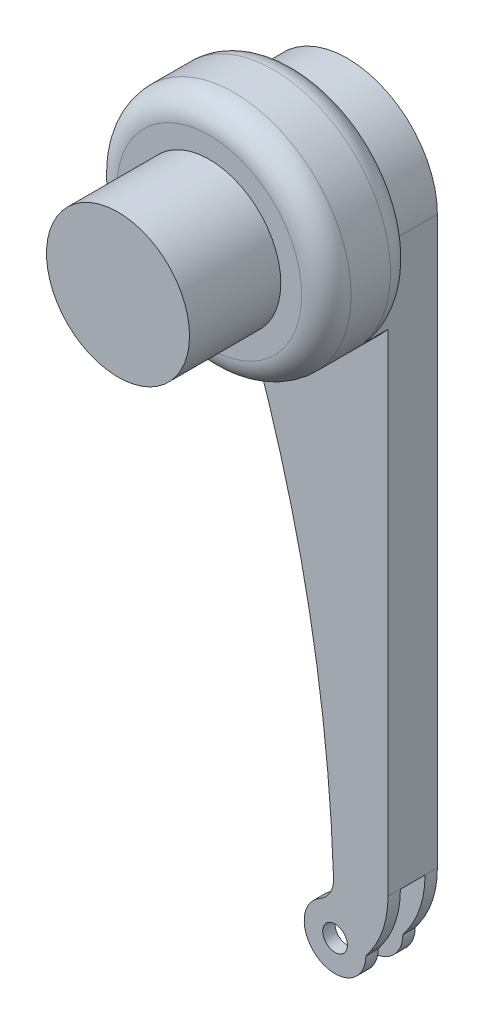
ISO-10303-21;
HEADER;
FILE_DESCRIPTION(('STEP AP214'),'2;1');
FILE_NAME('part.step','',(''),(''),'','','');
FILE_SCHEMA(('AUTOMOTIVE_DESIGN { 1 0 10303 214 1 1 1 1 }'));
ENDSEC;
DATA;
#1=APPLICATION_CONTEXT('core data for automotive mechanical design processes');
#2=APPLICATION_PROTOCOL_DEFINITION('international standard','automotive_design',2000,#1);
#3=PRODUCT_CONTEXT('',#1,'mechanical');
#4=PRODUCT('Part','Part','',(#3));
#5=PRODUCT_RELATED_PRODUCT_CATEGORY('part','',(#4));
#6=PRODUCT_DEFINITION_FORMATION('','',#4);
#7=PRODUCT_DEFINITION_CONTEXT('part definition',#1,'design');
#8=PRODUCT_DEFINITION('design','',#6,#7);
#9=PRODUCT_DEFINITION_SHAPE('','',#8);
#10=(LENGTH_UNIT() NAMED_UNIT(*) SI_UNIT(.MILLI.,.METRE.));
#11=(NAMED_UNIT(*) PLANE_ANGLE_UNIT() SI_UNIT($,.RADIAN.));
#12=(NAMED_UNIT(*) SI_UNIT($,.STERADIAN.) SOLID_ANGLE_UNIT());
#13=UNCERTAINTY_MEASURE_WITH_UNIT(LENGTH_MEASURE(1.E-05),#10,'distance_accuracy_value','');
#14=(GEOMETRIC_REPRESENTATION_CONTEXT(3) GLOBAL_UNCERTAINTY_ASSIGNED_CONTEXT((#13)) GLOBAL_UNIT_ASSIGNED_CONTEXT((#10,
#11,#12)) REPRESENTATION_CONTEXT('',''));
#15=CARTESIAN_POINT('',(0.,0.,0.));
#16=DIRECTION('',(0.,0.,1.));
#17=DIRECTION('',(1.,0.,0.));
#18=AXIS2_PLACEMENT_3D('',#15,#16,#17);
#19=CARTESIAN_POINT('',(14.3935138395394,-234.123931836955,-20.));
#20=CARTESIAN_POINT('',(9.34180295752292,-94.6674336041747,-20.));
#21=CARTESIAN_POINT('',(-37.9577807284117,-27.6638546174901,-20.));
#22=CARTESIAN_POINT('',(-36.4999928582539,-0.0228330333449487,-20.));
#23=B_SPLINE_CURVE_WITH_KNOTS('',3,(#19,#20,#21,#22),.UNSPECIFIED.,.F.,.F.,(4,4),(0.,
0.87838720733707),.UNSPECIFIED.);
#24=DIRECTION('',(0.,0.,1.));
#25=VECTOR('',#24,1.);
#26=SURFACE_OF_LINEAR_EXTRUSION('',#23,#25);
#27=CARTESIAN_POINT('',(14.3935138395394,-234.123931836955,-5.));
#28=CARTESIAN_POINT('',(9.34180295752292,-94.6674336041747,-5.));
#29=CARTESIAN_POINT('',(-37.9577807284117,-27.6638546174901,-5.));
#30=CARTESIAN_POINT('',(-36.4999928582539,-0.0228330333449487,-5.));
#31=B_SPLINE_CURVE_WITH_KNOTS('',3,(#27,#28,#29,#30),.UNSPECIFIED.,.F.,.F.,(4,4),(0.,
0.87838720733707),.UNSPECIFIED.);
#32=CARTESIAN_POINT('',(14.3935138395395,-234.123931836956,-5.));
#33=VERTEX_POINT('',#32);
#34=CARTESIAN_POINT('',(14.211921684478,-229.555725830061,-5.));
#35=VERTEX_POINT('',#34);
#36=EDGE_CURVE('E406',#33,#35,#31,.T.);
#37=ORIENTED_EDGE('',*,*,#36,.F.);
#38=DIRECTION('',(0.,0.,1.));
#39=VECTOR('',#38,1.);
#40=CARTESIAN_POINT('',(14.3935138395395,-234.123931836956,-20.));
#41=LINE('',#40,#39);
#42=CARTESIAN_POINT('',(14.3935138395395,-234.123931836956,0.));
#43=VERTEX_POINT('',#42);
#44=EDGE_CURVE('E226',#33,#43,#41,.T.);
#45=ORIENTED_EDGE('',*,*,#44,.T.);
#46=CARTESIAN_POINT('',(14.3935138395394,-234.123931836955,0.));
#47=CARTESIAN_POINT('',(9.34180295752292,-94.6674336041747,0.));
#48=CARTESIAN_POINT('',(-37.9577807284117,-27.6638546174901,0.));
#49=CARTESIAN_POINT('',(-36.4999928582539,-0.0228330333449487,0.));
#50=B_SPLINE_CURVE_WITH_KNOTS('',3,(#46,#47,#48,#49),.UNSPECIFIED.,.F.,.F.,(4,4),(0.,
0.87838720733707),.UNSPECIFIED.);
#51=CARTESIAN_POINT('',(-25.864844960888,-39.8404291536779,0.));
#52=VERTEX_POINT('',#51);
#53=EDGE_CURVE('E251',#43,#52,#50,.T.);
#54=ORIENTED_EDGE('',*,*,#53,.T.);
#55=DIRECTION('',(0.,0.,1.));
#56=VECTOR('',#55,1.);
#57=CARTESIAN_POINT('',(-25.8648449608881,-39.8404291536779,10.));
#58=LINE('',#57,#56);
#59=CARTESIAN_POINT('',(-25.8648449608881,-39.8404291536779,10.));
#60=VERTEX_POINT('',#59);
#61=EDGE_CURVE('E349',#60,#52,#58,.F.);
#62=ORIENTED_EDGE('',*,*,#61,.F.);
#63=CARTESIAN_POINT('',(-25.8648449608881,-39.8404291536779,10.));
#64=CARTESIAN_POINT('',(-25.8648441366713,-39.8404314005146,9.89995726036472));
#65=CARTESIAN_POINT('',(-25.8656964769188,-39.8380858399478,9.79993159686197));
#66=CARTESIAN_POINT('',(-25.8690969384051,-39.8287279453894,9.60013370202011));
#67=CARTESIAN_POINT('',(-25.8716449553815,-39.8217158983277,9.50036145547768));
#68=CARTESIAN_POINT('',(-25.8818085753463,-39.7937456471833,9.20197846168085));
#69=CARTESIAN_POINT('',(-25.8919438016662,-39.7658531845782,9.00405600332783));
#70=CARTESIAN_POINT('',(-25.9185600922197,-39.6926000000448,8.6139973054241));
#71=CARTESIAN_POINT('',(-25.9349774392155,-39.6474146725998,8.42182320923319));
#72=CARTESIAN_POINT('',(-25.9738007321069,-39.5405526136909,8.04271525505081));
#73=CARTESIAN_POINT('',(-25.9962077007512,-39.478873065781,7.85578229803072));
#74=CARTESIAN_POINT('',(-26.0464600050365,-39.3405280757323,7.48913989617603));
#75=CARTESIAN_POINT('',(-26.0742848483844,-39.2639191010004,7.30940621722387));
#76=CARTESIAN_POINT('',(-26.1349234715684,-39.0969409649844,6.95736291802618));
#77=CARTESIAN_POINT('',(-26.1677370790287,-39.0065722791367,6.78505304153141));
#78=CARTESIAN_POINT('',(-26.2379162315993,-38.8132635920711,6.44810446576558));
#79=CARTESIAN_POINT('',(-26.2752917883536,-38.7102959399215,6.28348377608598));
#80=CARTESIAN_POINT('',(-26.3540413081918,-38.4932966015652,5.96263188644846));
#81=CARTESIAN_POINT('',(-26.3954172363988,-38.3792594775337,5.80640486898085));
#82=CARTESIAN_POINT('',(-26.5009555465884,-38.0883045877545,5.4346528541214));
#83=CARTESIAN_POINT('',(-26.5670381170081,-37.9060595200095,5.22382632195328));
#84=CARTESIAN_POINT('',(-26.7052284082117,-37.5247611812529,4.82007430967963));
#85=CARTESIAN_POINT('',(-26.7773391712279,-37.3256994228638,4.62715797318304));
#86=CARTESIAN_POINT('',(-26.9264840774253,-36.9137282754019,4.25856104214027));
#87=CARTESIAN_POINT('',(-27.0035217154316,-36.7008090547561,4.08289291145655));
#88=CARTESIAN_POINT('',(-27.1614964553944,-36.2638628732628,3.74811046681155));
#89=CARTESIAN_POINT('',(-27.2424326258454,-36.0398385654677,3.58899222688679));
#90=CARTESIAN_POINT('',(-27.4144656749786,-35.5632367962216,3.27331860496223));
#91=CARTESIAN_POINT('',(-27.5058406504797,-35.3098530105248,3.11813725018904));
#92=CARTESIAN_POINT('',(-27.691495190165,-34.7944307977251,2.82453082679175));
#93=CARTESIAN_POINT('',(-27.7857764058113,-34.5323874435207,2.6861155141238));
#94=CARTESIAN_POINT('',(-27.9765483491195,-34.0014338894614,2.42472820039992));
#95=CARTESIAN_POINT('',(-28.0730396606381,-33.7325218728515,2.30176033716129));
#96=CARTESIAN_POINT('',(-28.2684767146181,-33.1869926386877,2.06901107722282));
#97=CARTESIAN_POINT('',(-28.3674362671631,-32.9103296669413,1.95934914707861));
#98=CARTESIAN_POINT('',(-28.5665220388424,-32.3527171215986,1.75317771485828));
#99=CARTESIAN_POINT('',(-28.6666477915293,-32.0717692488095,1.65666313789039));
#100=CARTESIAN_POINT('',(-28.8676844257774,-31.5064861919726,1.47557769579597));
#101=CARTESIAN_POINT('',(-28.9685949946948,-31.2221523349882,1.39100230824965));
#102=CARTESIAN_POINT('',(-29.2470065506942,-30.4358135410953,1.17307141431366));
#103=CARTESIAN_POINT('',(-29.4250433111612,-29.9308976158588,1.05085564878247));
#104=CARTESIAN_POINT('',(-29.781404663724,-28.9150753472292,0.83405490931411));
#105=CARTESIAN_POINT('',(-29.9597293627338,-28.4041657083063,0.739485955806199));
#106=CARTESIAN_POINT('',(-30.3158719632625,-27.3774664665809,0.57321813567452));
#107=CARTESIAN_POINT('',(-30.4936883800426,-26.8616697491574,0.501560635081314));
#108=CARTESIAN_POINT('',(-30.8479830503886,-25.8262792954077,0.377102293158273));
#109=CARTESIAN_POINT('',(-31.0244580781325,-25.3066801692982,0.324337930676167));
#110=CARTESIAN_POINT('',(-31.3752210154419,-24.2646759158633,0.234162115413052));
#111=CARTESIAN_POINT('',(-31.5495057189547,-23.7422679837245,0.196771087934264));
#112=CARTESIAN_POINT('',(-31.8856212629157,-22.7240056824462,0.135938715911539));
#113=CARTESIAN_POINT('',(-32.0476159895172,-22.2282426757222,0.111852486647409));
#114=CARTESIAN_POINT('',(-32.3680752124843,-21.2357984006193,0.0723015579089318));
#115=CARTESIAN_POINT('',(-32.5265431110085,-20.7391185665374,0.0568281702365222));
#116=CARTESIAN_POINT('',(-32.8390973663724,-19.7456541930669,0.0324350510142492));
#117=CARTESIAN_POINT('',(-32.9931940789619,-19.2488733099555,0.0234983208750869));
#118=CARTESIAN_POINT('',(-33.2961115835715,-18.2559989814237,0.0103770121883049));
#119=CARTESIAN_POINT('',(-33.4449523569944,-17.7599118971913,0.00617199375802741));
#120=CARTESIAN_POINT('',(-33.6637700797346,-17.0161196763371,0.0022855534051658));
#121=CARTESIAN_POINT('',(-33.7357529823084,-16.7690088168644,0.00139265136063418));
#122=CARTESIAN_POINT('',(-33.8782989576823,-16.2743765171776,0.000250905507337387));
#123=CARTESIAN_POINT('',(-33.948862030697,-16.0268550770255,2.0616013106902E-06));
#124=CARTESIAN_POINT('',(-34.018663089086,-15.7791178977551,0.));
#125=B_SPLINE_CURVE_WITH_KNOTS('',3,(#63,#64,#65,#66,#67,#68,#69,#70,#71,#72,#73,#74,#75,#76,
#77,#78,#79,#80,#81,#82,#83,#84,#85,#86,#87,#88,#89,#90,#91,#92,#93,#94,#95,#96,#97,#98,#99,
#100,#101,#102,#103,#104,#105,#106,#107,#108,#109,#110,#111,#112,#113,#114,#115,#116,#117,#118,
#119,#120,#121,#122,#123,#124),.UNSPECIFIED.,.F.,.F.,(4,2,2,2,2,2,2,2,2,2,2,2,2,2,2,2,2,2,2,2,2,
2,2,2,2,2,2,2,2,2,4),(0.,0.300063459456912,0.600108470512159,1.1994653998631,1.7928978430472,
2.38643168167635,2.977762711301,3.56907331342486,4.16170575979052,4.7546308216861,
5.61251293598461,6.47083063976318,7.32976408372104,8.18849330461224,9.12040436898165,
10.0528551222924,10.9855551155095,11.9260912333076,12.8662632681839,13.8060782162116,
15.452570127999,17.1000142457655,18.7504162015392,20.4039877834094,22.0597492869661,
23.6259937176312,25.1906553236676,26.7512334159787,28.3050439830849,29.0771892955142,
29.849334491339),.UNSPECIFIED.);
#126=CARTESIAN_POINT('',(-34.018663089086,-15.7791178977551,0.));
#127=VERTEX_POINT('',#126);
#128=EDGE_CURVE('E302',#60,#127,#125,.T.);
#129=ORIENTED_EDGE('',*,*,#128,.T.);
#130=CARTESIAN_POINT('',(-36.4999928582539,-0.0228330333449564,0.));
#131=VERTEX_POINT('',#130);
#132=EDGE_CURVE('E258',#127,#131,#50,.T.);
#133=ORIENTED_EDGE('',*,*,#132,.T.);
#134=DIRECTION('',(0.,0.,1.));
#135=VECTOR('',#134,1.);
#136=CARTESIAN_POINT('',(-36.4999928582539,-0.0228330333449564,-20.));
#137=LINE('',#136,#135);
#138=CARTESIAN_POINT('',(-36.4999928582539,-0.0228330333449564,-20.));
#139=VERTEX_POINT('',#138);
#140=EDGE_CURVE('E198',#139,#131,#137,.T.);
#141=ORIENTED_EDGE('',*,*,#140,.F.);
#142=CARTESIAN_POINT('',(14.3935138395395,-234.123931836956,-20.));
#143=VERTEX_POINT('',#142);
#144=EDGE_CURVE('E231',#143,#139,#23,.T.);
#145=ORIENTED_EDGE('',*,*,#144,.F.);
#146=CARTESIAN_POINT('',(14.3935138395395,-234.123931836956,-15.));
#147=VERTEX_POINT('',#146);
#148=EDGE_CURVE('E222',#143,#147,#41,.T.);
#149=ORIENTED_EDGE('',*,*,#148,.T.);
#150=CARTESIAN_POINT('',(14.3935138395394,-234.123931836955,-15.));
#151=CARTESIAN_POINT('',(9.34180295752292,-94.6674336041747,-15.));
#152=CARTESIAN_POINT('',(-37.9577807284117,-27.6638546174901,-15.));
#153=CARTESIAN_POINT('',(-36.4999928582539,-0.0228330333449487,-15.));
#154=B_SPLINE_CURVE_WITH_KNOTS('',3,(#150,#151,#152,#153),.UNSPECIFIED.,.F.,.F.,(4,4),(0.,
0.87838720733707),.UNSPECIFIED.);
#155=CARTESIAN_POINT('',(14.211921684478,-229.555725830061,-15.));
#156=VERTEX_POINT('',#155);
#157=EDGE_CURVE('E60',#156,#147,#154,.F.);
#158=ORIENTED_EDGE('',*,*,#157,.F.);
#159=DIRECTION('',(0.,0.,1.));
#160=VECTOR('',#159,1.);
#161=CARTESIAN_POINT('',(14.2119216844779,-229.555725830061,-20.));
#162=LINE('',#161,#160);
#163=EDGE_CURVE('E177',#35,#156,#162,.F.);
#164=ORIENTED_EDGE('',*,*,#163,.F.);
#165=EDGE_LOOP('',(#37,#45,#54,#62,#129,#133,#141,#145,#149,#158,#164));
#166=FACE_BOUND('',#165,.T.);
#167=ADVANCED_FACE('F42',(#166),#26,.F.);
#168=CARTESIAN_POINT('',(-3.50000000000003,-229.555725830061,-20.));
#169=DIRECTION('',(0.,0.,1.));
#170=DIRECTION('',(1.,0.,0.));
#171=AXIS2_PLACEMENT_3D('',#168,#169,#170);
#172=CYLINDRICAL_SURFACE('',#171,40.);
#173=CARTESIAN_POINT('',(-3.50000000000003,-229.555725830061,-5.));
#174=DIRECTION('',(0.,0.,-1.));
#175=DIRECTION('',(0.,1.,0.));
#176=AXIS2_PLACEMENT_3D('',#173,#174,#175);
#177=CIRCLE('',#176,40.);
#178=CARTESIAN_POINT('',(36.5,-229.555725830061,-5.));
#179=VERTEX_POINT('',#178);
#180=CARTESIAN_POINT('',(29.1730691639795,-252.631049260206,-5.));
#181=VERTEX_POINT('',#180);
#182=EDGE_CURVE('E403',#179,#181,#177,.T.);
#183=ORIENTED_EDGE('',*,*,#182,.F.);
#184=DIRECTION('',(0.,0.,1.));
#185=VECTOR('',#184,1.);
#186=CARTESIAN_POINT('',(36.5,-229.555725830061,-20.));
#187=LINE('',#186,#185);
#188=CARTESIAN_POINT('',(36.5,-229.555725830061,0.));
#189=VERTEX_POINT('',#188);
#190=EDGE_CURVE('E189',#179,#189,#187,.T.);
#191=ORIENTED_EDGE('',*,*,#190,.T.);
#192=CARTESIAN_POINT('',(-3.50000000000003,-229.555725830061,0.));
#193=DIRECTION('',(0.,0.,-1.));
#194=DIRECTION('',(1.,0.,0.));
#195=AXIS2_PLACEMENT_3D('',#192,#193,#194);
#196=CIRCLE('',#195,40.);
#197=CARTESIAN_POINT('',(29.1730691639795,-252.631049260206,0.));
#198=VERTEX_POINT('',#197);
#199=EDGE_CURVE('E240',#189,#198,#196,.T.);
#200=ORIENTED_EDGE('',*,*,#199,.T.);
#201=DIRECTION('',(0.,0.,1.));
#202=VECTOR('',#201,1.);
#203=CARTESIAN_POINT('',(29.1730691639795,-252.631049260206,-20.));
#204=LINE('',#203,#202);
#205=EDGE_CURVE('E207',#181,#198,#204,.T.);
#206=ORIENTED_EDGE('',*,*,#205,.F.);
#207=EDGE_LOOP('',(#183,#191,#200,#206));
#208=FACE_BOUND('',#207,.T.);
#209=ADVANCED_FACE('F295',(#208),#172,.T.);
#210=CARTESIAN_POINT('',(-3.50000000000003,-229.555725830061,-15.));
#211=DIRECTION('',(0.,0.,1.));
#212=DIRECTION('',(0.,-1.,0.));
#213=AXIS2_PLACEMENT_3D('',#210,#211,#212);
#214=CIRCLE('',#213,40.);
#215=CARTESIAN_POINT('',(29.1730691639795,-252.631049260206,-15.));
#216=VERTEX_POINT('',#215);
#217=CARTESIAN_POINT('',(36.5,-229.555725830061,-15.));
#218=VERTEX_POINT('',#217);
#219=EDGE_CURVE('E158',#216,#218,#214,.T.);
#220=ORIENTED_EDGE('',*,*,#219,.F.);
#221=CARTESIAN_POINT('',(29.1730691639795,-252.631049260206,-20.));
#222=VERTEX_POINT('',#221);
#223=EDGE_CURVE('E202',#222,#216,#204,.T.);
#224=ORIENTED_EDGE('',*,*,#223,.F.);
#225=CARTESIAN_POINT('',(-3.50000000000003,-229.555725830061,-20.));
#226=DIRECTION('',(0.,0.,-1.));
#227=DIRECTION('',(1.,0.,0.));
#228=AXIS2_PLACEMENT_3D('',#225,#226,#227);
#229=CIRCLE('',#228,40.);
#230=CARTESIAN_POINT('',(36.5,-229.555725830061,-20.));
#231=VERTEX_POINT('',#230);
#232=EDGE_CURVE('E193',#231,#222,#229,.T.);
#233=ORIENTED_EDGE('',*,*,#232,.F.);
#234=EDGE_CURVE('E187',#231,#218,#187,.T.);
#235=ORIENTED_EDGE('',*,*,#234,.T.);
#236=EDGE_LOOP('',(#220,#224,#233,#235));
#237=FACE_BOUND('',#236,.T.);
#238=ADVANCED_FACE('F192',(#237),#172,.T.);
#239=CARTESIAN_POINT('',(29.1730691639795,-252.631049260206,-20.));
#240=DIRECTION('',(-0.816826729099489,0.57688308575363,0.));
#241=DIRECTION('',(-0.57688308575363,-0.816826729099489,0.));
#242=AXIS2_PLACEMENT_3D('',#239,#240,#241);
#243=PLANE('',#242);
#244=DIRECTION('',(-0.57688308575363,-0.816826729099489,0.));
#245=VECTOR('',#244,1.);
#246=CARTESIAN_POINT('',(29.1730691639795,-252.631049260206,-5.));
#247=LINE('',#246,#245);
#248=CARTESIAN_POINT('',(27.5,-255.,-5.));
#249=VERTEX_POINT('',#248);
#250=EDGE_CURVE('E400',#181,#249,#247,.T.);
#251=ORIENTED_EDGE('',*,*,#250,.F.);
#252=ORIENTED_EDGE('',*,*,#205,.T.);
#253=DIRECTION('',(-0.57688308575363,-0.816826729099489,0.));
#254=VECTOR('',#253,1.);
#255=CARTESIAN_POINT('',(29.1730691639795,-252.631049260206,0.));
#256=LINE('',#255,#254);
#257=CARTESIAN_POINT('',(27.5,-255.,0.));
#258=VERTEX_POINT('',#257);
#259=EDGE_CURVE('E236',#198,#258,#256,.T.);
#260=ORIENTED_EDGE('',*,*,#259,.T.);
#261=DIRECTION('',(0.,0.,1.));
#262=VECTOR('',#261,1.);
#263=CARTESIAN_POINT('',(27.5,-255.,-20.));
#264=LINE('',#263,#262);
#265=EDGE_CURVE('E216',#249,#258,#264,.T.);
#266=ORIENTED_EDGE('',*,*,#265,.F.);
#267=EDGE_LOOP('',(#251,#252,#260,#266));
#268=FACE_BOUND('',#267,.T.);
#269=ADVANCED_FACE('F452',(#268),#243,.F.);
#270=DIRECTION('',(0.57688308575363,0.816826729099489,0.));
#271=VECTOR('',#270,1.);
#272=CARTESIAN_POINT('',(29.1730691639795,-252.631049260206,-15.));
#273=LINE('',#272,#271);
#274=CARTESIAN_POINT('',(27.5,-255.,-15.));
#275=VERTEX_POINT('',#274);
#276=EDGE_CURVE('E163',#275,#216,#273,.T.);
#277=ORIENTED_EDGE('',*,*,#276,.F.);
#278=CARTESIAN_POINT('',(27.5,-255.,-20.));
#279=VERTEX_POINT('',#278);
#280=EDGE_CURVE('E211',#279,#275,#264,.T.);
#281=ORIENTED_EDGE('',*,*,#280,.F.);
#282=DIRECTION('',(-0.57688308575363,-0.816826729099489,0.));
#283=VECTOR('',#282,1.);
#284=CARTESIAN_POINT('',(29.1730691639795,-252.631049260206,-20.));
#285=LINE('',#284,#283);
#286=EDGE_CURVE('E268',#222,#279,#285,.T.);
#287=ORIENTED_EDGE('',*,*,#286,.F.);
#288=ORIENTED_EDGE('',*,*,#223,.T.);
#289=EDGE_LOOP('',(#277,#281,#287,#288));
#290=FACE_BOUND('',#289,.T.);
#291=ADVANCED_FACE('F489',(#290),#243,.F.);
#292=CARTESIAN_POINT('',(15.,-255.,-20.));
#293=DIRECTION('',(0.,0.,1.));
#294=DIRECTION('',(1.,0.,0.));
#295=AXIS2_PLACEMENT_3D('',#292,#293,#294);
#296=CYLINDRICAL_SURFACE('',#295,12.5);
#297=CARTESIAN_POINT('',(15.,-255.,-5.));
#298=DIRECTION('',(0.,0.,-1.));
#299=DIRECTION('',(0.,1.,0.));
#300=AXIS2_PLACEMENT_3D('',#297,#298,#299);
#301=CIRCLE('',#300,12.5);
#302=CARTESIAN_POINT('',(8.86927739920417,-244.106688272518,-5.));
#303=VERTEX_POINT('',#302);
#304=EDGE_CURVE('E397',#249,#303,#301,.T.);
#305=ORIENTED_EDGE('',*,*,#304,.F.);
#306=ORIENTED_EDGE('',*,*,#265,.T.);
#307=CARTESIAN_POINT('',(15.,-255.,0.));
#308=DIRECTION('',(0.,0.,-1.));
#309=DIRECTION('',(-1.,0.,0.));
#310=AXIS2_PLACEMENT_3D('',#307,#308,#309);
#311=CIRCLE('',#310,12.5);
#312=CARTESIAN_POINT('',(8.86927739920417,-244.106688272518,0.));
#313=VERTEX_POINT('',#312);
#314=EDGE_CURVE('E232',#258,#313,#311,.T.);
#315=ORIENTED_EDGE('',*,*,#314,.T.);
#316=DIRECTION('',(0.,0.,1.));
#317=VECTOR('',#316,1.);
#318=CARTESIAN_POINT('',(8.86927739920417,-244.106688272518,-20.));
#319=LINE('',#318,#317);
#320=EDGE_CURVE('E221',#303,#313,#319,.T.);
#321=ORIENTED_EDGE('',*,*,#320,.F.);
#322=EDGE_LOOP('',(#305,#306,#315,#321));
#323=FACE_BOUND('',#322,.T.);
#324=ADVANCED_FACE('F446',(#323),#296,.T.);
#325=CARTESIAN_POINT('',(15.,-255.,-15.));
#326=DIRECTION('',(0.,0.,1.));
#327=DIRECTION('',(0.,-1.,0.));
#328=AXIS2_PLACEMENT_3D('',#325,#326,#327);
#329=CIRCLE('',#328,12.5);
#330=CARTESIAN_POINT('',(8.86927739920417,-244.106688272518,-15.));
#331=VERTEX_POINT('',#330);
#332=EDGE_CURVE('E377',#331,#275,#329,.T.);
#333=ORIENTED_EDGE('',*,*,#332,.F.);
#334=CARTESIAN_POINT('',(8.86927739920417,-244.106688272518,-20.));
#335=VERTEX_POINT('',#334);
#336=EDGE_CURVE('E217',#335,#331,#319,.T.);
#337=ORIENTED_EDGE('',*,*,#336,.F.);
#338=CARTESIAN_POINT('',(15.,-255.,-20.));
#339=DIRECTION('',(0.,0.,-1.));
#340=DIRECTION('',(-1.,0.,0.));
#341=AXIS2_PLACEMENT_3D('',#338,#339,#340);
#342=CIRCLE('',#341,12.5);
#343=EDGE_CURVE('E265',#279,#335,#342,.T.);
#344=ORIENTED_EDGE('',*,*,#343,.F.);
#345=ORIENTED_EDGE('',*,*,#280,.T.);
#346=EDGE_LOOP('',(#333,#337,#344,#345));
#347=FACE_BOUND('',#346,.T.);
#348=ADVANCED_FACE('F487',(#347),#296,.T.);
#349=CARTESIAN_POINT('',(3.54024076980626,-234.637844060962,-20.));
#350=DIRECTION('',(0.,0.,1.));
#351=DIRECTION('',(1.,0.,0.));
#352=AXIS2_PLACEMENT_3D('',#349,#350,#351);
#353=CYLINDRICAL_SURFACE('',#352,10.8654333599806);
#354=CARTESIAN_POINT('',(3.54024076980626,-234.637844060962,-5.));
#355=DIRECTION('',(0.,0.,-1.));
#356=DIRECTION('',(0.,1.,0.));
#357=AXIS2_PLACEMENT_3D('',#354,#355,#356);
#358=CIRCLE('',#357,10.8654333599806);
#359=EDGE_CURVE('E391',#303,#33,#358,.F.);
#360=ORIENTED_EDGE('',*,*,#359,.F.);
#361=ORIENTED_EDGE('',*,*,#320,.T.);
#362=CARTESIAN_POINT('',(3.54024076980626,-234.637844060962,0.));
#363=DIRECTION('',(0.,0.,1.));
#364=DIRECTION('',(-1.,0.,0.));
#365=AXIS2_PLACEMENT_3D('',#362,#363,#364);
#366=CIRCLE('',#365,10.8654333599806);
#367=EDGE_CURVE('E227',#313,#43,#366,.T.);
#368=ORIENTED_EDGE('',*,*,#367,.T.);
#369=ORIENTED_EDGE('',*,*,#44,.F.);
#370=EDGE_LOOP('',(#360,#361,#368,#369));
#371=FACE_BOUND('',#370,.T.);
#372=ADVANCED_FACE('F457',(#371),#353,.F.);
#373=CARTESIAN_POINT('',(3.54024076980626,-234.637844060962,-15.));
#374=DIRECTION('',(0.,0.,1.));
#375=DIRECTION('',(0.,-1.,0.));
#376=AXIS2_PLACEMENT_3D('',#373,#374,#375);
#377=CIRCLE('',#376,10.8654333599806);
#378=EDGE_CURVE('E374',#147,#331,#377,.F.);
#379=ORIENTED_EDGE('',*,*,#378,.F.);
#380=ORIENTED_EDGE('',*,*,#148,.F.);
#381=CARTESIAN_POINT('',(3.54024076980626,-234.637844060962,-20.));
#382=DIRECTION('',(0.,0.,1.));
#383=DIRECTION('',(-1.,0.,0.));
#384=AXIS2_PLACEMENT_3D('',#381,#382,#383);
#385=CIRCLE('',#384,10.8654333599806);
#386=EDGE_CURVE('E259',#335,#143,#385,.T.);
#387=ORIENTED_EDGE('',*,*,#386,.F.);
#388=ORIENTED_EDGE('',*,*,#336,.T.);
#389=EDGE_LOOP('',(#379,#380,#387,#388));
#390=FACE_BOUND('',#389,.T.);
#391=ADVANCED_FACE('F373',(#390),#353,.F.);
#392=CARTESIAN_POINT('',(15.,-255.,24.));
#393=DIRECTION('',(0.,0.,-1.));
#394=DIRECTION('',(-1.,0.,0.));
#395=AXIS2_PLACEMENT_3D('',#392,#393,#394);
#396=CYLINDRICAL_SURFACE('',#395,5.);
#397=CARTESIAN_POINT('',(15.,-255.,0.));
#398=DIRECTION('',(0.,0.,-1.));
#399=DIRECTION('',(-1.,0.,0.));
#400=AXIS2_PLACEMENT_3D('',#397,#398,#399);
#401=CIRCLE('',#400,5.);
#402=CARTESIAN_POINT('',(9.99999999999997,-255.,0.));
#403=VERTEX_POINT('',#402);
#404=EDGE_CURVE('E419',#403,#403,#401,.T.);
#405=CARTESIAN_POINT('',(15.,-255.,-5.));
#406=DIRECTION('',(0.,0.,-1.));
#407=DIRECTION('',(0.,1.,0.));
#408=AXIS2_PLACEMENT_3D('',#405,#406,#407);
#409=CIRCLE('',#408,5.);
#410=CARTESIAN_POINT('',(9.99999999999997,-255.,-5.));
#411=VERTEX_POINT('',#410);
#412=EDGE_CURVE('E46',#411,#411,#409,.F.);
#413=CARTESIAN_POINT('',(9.99999999999997,-255.,0.));
#414=CARTESIAN_POINT('',(9.99999999999997,-255.,-0.0520833333333299));
#415=CARTESIAN_POINT('',(9.99999999999997,-255.,-0.104166666666663));
#416=CARTESIAN_POINT('',(9.99999999999997,-255.,-0.20833333333333));
#417=CARTESIAN_POINT('',(9.99999999999997,-255.,-0.260416666666663));
#418=CARTESIAN_POINT('',(9.99999999999997,-255.,-0.36458333333333));
#419=CARTESIAN_POINT('',(9.99999999999997,-255.,-0.416666666666664));
#420=CARTESIAN_POINT('',(9.99999999999997,-255.,-0.52083333333333));
#421=CARTESIAN_POINT('',(9.99999999999997,-255.,-0.572916666666664));
#422=CARTESIAN_POINT('',(9.99999999999997,-255.,-0.67708333333333));
#423=CARTESIAN_POINT('',(9.99999999999997,-255.,-0.729166666666664));
#424=CARTESIAN_POINT('',(9.99999999999997,-255.,-0.833333333333331));
#425=CARTESIAN_POINT('',(9.99999999999997,-255.,-0.885416666666664));
#426=CARTESIAN_POINT('',(9.99999999999997,-255.,-0.989583333333331));
#427=CARTESIAN_POINT('',(9.99999999999997,-255.,-1.04166666666666));
#428=CARTESIAN_POINT('',(9.99999999999997,-255.,-1.14583333333333));
#429=CARTESIAN_POINT('',(9.99999999999997,-255.,-1.19791666666666));
#430=CARTESIAN_POINT('',(9.99999999999997,-255.,-1.30208333333333));
#431=CARTESIAN_POINT('',(9.99999999999997,-255.,-1.35416666666666));
#432=CARTESIAN_POINT('',(9.99999999999997,-255.,-1.45833333333333));
#433=CARTESIAN_POINT('',(9.99999999999997,-255.,-1.51041666666666));
#434=CARTESIAN_POINT('',(9.99999999999997,-255.,-1.61458333333333));
#435=CARTESIAN_POINT('',(9.99999999999997,-255.,-1.66666666666666));
#436=CARTESIAN_POINT('',(9.99999999999997,-255.,-1.77083333333333));
#437=CARTESIAN_POINT('',(9.99999999999997,-255.,-1.82291666666666));
#438=CARTESIAN_POINT('',(9.99999999999997,-255.,-1.92708333333333));
#439=CARTESIAN_POINT('',(9.99999999999997,-255.,-1.97916666666667));
#440=CARTESIAN_POINT('',(9.99999999999997,-255.,-2.08333333333333));
#441=CARTESIAN_POINT('',(9.99999999999997,-255.,-2.13541666666667));
#442=CARTESIAN_POINT('',(9.99999999999997,-255.,-2.23958333333333));
#443=CARTESIAN_POINT('',(9.99999999999997,-255.,-2.29166666666667));
#444=CARTESIAN_POINT('',(9.99999999999997,-255.,-2.39583333333333));
#445=CARTESIAN_POINT('',(9.99999999999997,-255.,-2.44791666666667));
#446=CARTESIAN_POINT('',(9.99999999999997,-255.,-2.55208333333333));
#447=CARTESIAN_POINT('',(9.99999999999997,-255.,-2.60416666666667));
#448=CARTESIAN_POINT('',(9.99999999999997,-255.,-2.70833333333333));
#449=CARTESIAN_POINT('',(9.99999999999997,-255.,-2.76041666666667));
#450=CARTESIAN_POINT('',(9.99999999999997,-255.,-2.86458333333333));
#451=CARTESIAN_POINT('',(9.99999999999997,-255.,-2.91666666666667));
#452=CARTESIAN_POINT('',(9.99999999999997,-255.,-3.02083333333333));
#453=CARTESIAN_POINT('',(9.99999999999997,-255.,-3.07291666666667));
#454=CARTESIAN_POINT('',(9.99999999999997,-255.,-3.17708333333333));
#455=CARTESIAN_POINT('',(9.99999999999997,-255.,-3.22916666666667));
#456=CARTESIAN_POINT('',(9.99999999999997,-255.,-3.33333333333333));
#457=CARTESIAN_POINT('',(9.99999999999997,-255.,-3.38541666666667));
#458=CARTESIAN_POINT('',(9.99999999999997,-255.,-3.48958333333333));
#459=CARTESIAN_POINT('',(9.99999999999997,-255.,-3.54166666666667));
#460=CARTESIAN_POINT('',(9.99999999999997,-255.,-3.64583333333333));
#461=CARTESIAN_POINT('',(9.99999999999997,-255.,-3.69791666666667));
#462=CARTESIAN_POINT('',(9.99999999999997,-255.,-3.80208333333333));
#463=CARTESIAN_POINT('',(9.99999999999997,-255.,-3.85416666666667));
#464=CARTESIAN_POINT('',(9.99999999999997,-255.,-3.95833333333333));
#465=CARTESIAN_POINT('',(9.99999999999997,-255.,-4.01041666666667));
#466=CARTESIAN_POINT('',(9.99999999999997,-255.,-4.11458333333333));
#467=CARTESIAN_POINT('',(9.99999999999997,-255.,-4.16666666666667));
#468=CARTESIAN_POINT('',(9.99999999999997,-255.,-4.27083333333333));
#469=CARTESIAN_POINT('',(9.99999999999997,-255.,-4.32291666666667));
#470=CARTESIAN_POINT('',(9.99999999999997,-255.,-4.42708333333333));
#471=CARTESIAN_POINT('',(9.99999999999997,-255.,-4.47916666666667));
#472=CARTESIAN_POINT('',(9.99999999999997,-255.,-4.58333333333333));
#473=CARTESIAN_POINT('',(9.99999999999997,-255.,-4.63541666666667));
#474=CARTESIAN_POINT('',(9.99999999999997,-255.,-4.73958333333333));
#475=CARTESIAN_POINT('',(9.99999999999997,-255.,-4.79166666666667));
#476=CARTESIAN_POINT('',(9.99999999999997,-255.,-4.89583333333333));
#477=CARTESIAN_POINT('',(9.99999999999997,-255.,-4.94791666666667));
#478=CARTESIAN_POINT('',(9.99999999999997,-255.,-5.));
#479=B_SPLINE_CURVE_WITH_KNOTS('',3,(#413,#414,#415,#416,#417,#418,#419,#420,#421,#422,#423,
#424,#425,#426,#427,#428,#429,#430,#431,#432,#433,#434,#435,#436,#437,#438,#439,#440,#441,#442,
#443,#444,#445,#446,#447,#448,#449,#450,#451,#452,#453,#454,#455,#456,#457,#458,#459,#460,#461,
#462,#463,#464,#465,#466,#467,#468,#469,#470,#471,#472,#473,#474,#475,#476,#477,#478),
.UNSPECIFIED.,.F.,.F.,(4,2,2,2,2,2,2,2,2,2,2,2,2,2,2,2,2,2,2,2,2,2,2,2,2,2,2,2,2,2,2,2,4),(0.,
0.15625,0.3125,0.46875,0.625000000000001,0.781250000000001,0.937500000000001,1.09375,1.25,
1.40625,1.5625,1.71875,1.875,2.03125,2.1875,2.34375,2.5,2.65625,2.8125,2.96875,3.125,3.28125,
3.4375,3.59375,3.75,3.90625,4.0625,4.21875,4.375,4.53125,4.6875,4.84375,5.),.UNSPECIFIED.);
#480=EDGE_CURVE('BSEAM587',#403,#411,#479,.T.);
#481=ORIENTED_EDGE('',*,*,#404,.F.);
#482=ORIENTED_EDGE('',*,*,#412,.F.);
#483=ORIENTED_EDGE('',*,*,#480,.T.);
#484=ORIENTED_EDGE('',*,*,#480,.F.);
#485=EDGE_LOOP('',(#481,#483,#482,#484));
#486=FACE_BOUND('',#485,.T.);
#487=ADVANCED_FACE('F587',(#486),#396,.F.);
#488=CARTESIAN_POINT('',(15.,-255.,-20.));
#489=DIRECTION('',(0.,0.,-1.));
#490=DIRECTION('',(-1.,0.,0.));
#491=AXIS2_PLACEMENT_3D('',#488,#489,#490);
#492=CIRCLE('',#491,5.);
#493=CARTESIAN_POINT('',(9.99999999999997,-255.,-20.));
#494=VERTEX_POINT('',#493);
#495=EDGE_CURVE('E416',#494,#494,#492,.T.);
#496=ORIENTED_EDGE('',*,*,#495,.T.);
#497=EDGE_LOOP('',(#496));
#498=FACE_BOUND('',#497,.T.);
#499=CARTESIAN_POINT('',(15.,-255.,-15.));
#500=DIRECTION('',(0.,0.,1.));
#501=DIRECTION('',(0.,-1.,0.));
#502=AXIS2_PLACEMENT_3D('',#499,#500,#501);
#503=CIRCLE('',#502,5.);
#504=CARTESIAN_POINT('',(15.,-260.,-15.));
#505=VERTEX_POINT('',#504);
#506=EDGE_CURVE('E179',#505,#505,#503,.F.);
#507=ORIENTED_EDGE('',*,*,#506,.F.);
#508=EDGE_LOOP('',(#507));
#509=FACE_BOUND('',#508,.T.);
#510=ADVANCED_FACE('F327',(#498,#509),#396,.F.);
#511=CARTESIAN_POINT('',(0.,0.,36.));
#512=DIRECTION('',(0.,0.,-1.));
#513=DIRECTION('',(-1.,0.,0.));
#514=AXIS2_PLACEMENT_3D('',#511,#512,#513);
#515=CYLINDRICAL_SURFACE('',#514,47.5);
#516=CARTESIAN_POINT('',(0.,0.,26.));
#517=DIRECTION('',(0.,0.,1.));
#518=DIRECTION('',(1.,0.,0.));
#519=AXIS2_PLACEMENT_3D('',#516,#517,#518);
#520=CIRCLE('',#519,47.5);
#521=CARTESIAN_POINT('',(47.5,0.,26.));
#522=VERTEX_POINT('',#521);
#523=EDGE_CURVE('E11',#522,#522,#520,.F.);
#524=ORIENTED_EDGE('',*,*,#523,.T.);
#525=EDGE_LOOP('',(#524));
#526=FACE_BOUND('',#525,.T.);
#527=CARTESIAN_POINT('',(0.,0.,10.));
#528=DIRECTION('',(0.,0.,1.));
#529=DIRECTION('',(1.,0.,0.));
#530=AXIS2_PLACEMENT_3D('',#527,#528,#529);
#531=CIRCLE('',#530,47.5);
#532=CARTESIAN_POINT('',(36.5,-30.3973683071413,10.));
#533=VERTEX_POINT('',#532);
#534=EDGE_CURVE('E351',#533,#60,#531,.T.);
#535=ORIENTED_EDGE('',*,*,#534,.T.);
#536=ORIENTED_EDGE('',*,*,#61,.T.);
#537=CARTESIAN_POINT('',(0.,0.,0.));
#538=DIRECTION('',(0.,0.,1.));
#539=DIRECTION('',(1.,0.,0.));
#540=AXIS2_PLACEMENT_3D('',#537,#538,#539);
#541=CIRCLE('',#540,47.5);
#542=CARTESIAN_POINT('',(36.5,-30.3973683071413,0.));
#543=VERTEX_POINT('',#542);
#544=EDGE_CURVE('E344',#52,#543,#541,.T.);
#545=ORIENTED_EDGE('',*,*,#544,.T.);
#546=DIRECTION('',(0.,0.,-1.));
#547=VECTOR('',#546,1.);
#548=CARTESIAN_POINT('',(36.5,-30.3973683071413,0.));
#549=LINE('',#548,#547);
#550=EDGE_CURVE('E68',#543,#533,#549,.F.);
#551=ORIENTED_EDGE('',*,*,#550,.T.);
#552=EDGE_LOOP('',(#535,#536,#545,#551));
#553=FACE_BOUND('',#552,.T.);
#554=ADVANCED_FACE('F324',(#526,#553),#515,.T.);
#555=CARTESIAN_POINT('',(0.,0.,36.));
#556=DIRECTION('',(0.,0.,1.));
#557=DIRECTION('',(1.,0.,0.));
#558=AXIS2_PLACEMENT_3D('',#555,#556,#557);
#559=PLANE('',#558);
#560=CARTESIAN_POINT('',(0.,0.,36.));
#561=DIRECTION('',(0.,0.,1.));
#562=DIRECTION('',(1.,0.,0.));
#563=AXIS2_PLACEMENT_3D('',#560,#561,#562);
#564=CIRCLE('',#563,37.5);
#565=CARTESIAN_POINT('',(37.5,0.,36.));
#566=VERTEX_POINT('',#565);
#567=EDGE_CURVE('E52',#566,#566,#564,.T.);
#568=ORIENTED_EDGE('',*,*,#567,.T.);
#569=EDGE_LOOP('',(#568));
#570=FACE_BOUND('',#569,.T.);
#571=CARTESIAN_POINT('',(0.,0.,36.));
#572=DIRECTION('',(0.,0.,1.));
#573=DIRECTION('',(1.,0.,0.));
#574=AXIS2_PLACEMENT_3D('',#571,#572,#573);
#575=CIRCLE('',#574,29.);
#576=CARTESIAN_POINT('',(29.,0.,36.));
#577=VERTEX_POINT('',#576);
#578=EDGE_CURVE('E285',#577,#577,#575,.T.);
#579=ORIENTED_EDGE('',*,*,#578,.F.);
#580=EDGE_LOOP('',(#579));
#581=FACE_BOUND('',#580,.T.);
#582=ADVANCED_FACE('F299',(#570,#581),#559,.T.);
#583=CARTESIAN_POINT('',(0.,0.,0.));
#584=DIRECTION('',(0.,0.,1.));
#585=DIRECTION('',(1.,0.,0.));
#586=AXIS2_PLACEMENT_3D('',#583,#584,#585);
#587=PLANE('',#586);
#588=ORIENTED_EDGE('',*,*,#132,.F.);
#589=CARTESIAN_POINT('',(0.,0.,0.));
#590=DIRECTION('',(0.,0.,1.));
#591=DIRECTION('',(1.,0.,0.));
#592=AXIS2_PLACEMENT_3D('',#589,#590,#591);
#593=CIRCLE('',#592,37.5);
#594=CARTESIAN_POINT('',(36.5,-8.60232526704266,0.));
#595=VERTEX_POINT('',#594);
#596=EDGE_CURVE('E311',#127,#595,#593,.F.);
#597=ORIENTED_EDGE('',*,*,#596,.T.);
#598=DIRECTION('',(0.,-1.,0.));
#599=VECTOR('',#598,1.);
#600=CARTESIAN_POINT('',(36.5,0.,0.));
#601=LINE('',#600,#599);
#602=CARTESIAN_POINT('',(36.5,0.,0.));
#603=VERTEX_POINT('',#602);
#604=EDGE_CURVE('E243',#603,#595,#601,.T.);
#605=ORIENTED_EDGE('',*,*,#604,.F.);
#606=CARTESIAN_POINT('',(0.,0.,0.));
#607=DIRECTION('',(0.,0.,-1.));
#608=DIRECTION('',(-1.,0.,0.));
#609=AXIS2_PLACEMENT_3D('',#606,#607,#608);
#610=CIRCLE('',#609,36.5);
#611=EDGE_CURVE('E247',#131,#603,#610,.T.);
#612=ORIENTED_EDGE('',*,*,#611,.F.);
#613=EDGE_LOOP('',(#588,#597,#605,#612));
#614=FACE_BOUND('',#613,.T.);
#615=ADVANCED_FACE('F329',(#614),#587,.F.);
#616=CARTESIAN_POINT('',(0.,0.,-20.));
#617=DIRECTION('',(0.,0.,1.));
#618=DIRECTION('',(1.,0.,0.));
#619=AXIS2_PLACEMENT_3D('',#616,#617,#618);
#620=CYLINDRICAL_SURFACE('',#619,36.5);
#621=ORIENTED_EDGE('',*,*,#611,.T.);
#622=DIRECTION('',(0.,0.,1.));
#623=VECTOR('',#622,1.);
#624=CARTESIAN_POINT('',(36.5,0.,-20.));
#625=LINE('',#624,#623);
#626=CARTESIAN_POINT('',(36.5,0.,-20.));
#627=VERTEX_POINT('',#626);
#628=EDGE_CURVE('E195',#627,#603,#625,.T.);
#629=ORIENTED_EDGE('',*,*,#628,.F.);
#630=CARTESIAN_POINT('',(0.,0.,-20.));
#631=DIRECTION('',(0.,0.,-1.));
#632=DIRECTION('',(-1.,0.,0.));
#633=AXIS2_PLACEMENT_3D('',#630,#631,#632);
#634=CIRCLE('',#633,36.5);
#635=EDGE_CURVE('E276',#139,#627,#634,.T.);
#636=ORIENTED_EDGE('',*,*,#635,.F.);
#637=ORIENTED_EDGE('',*,*,#140,.T.);
#638=EDGE_LOOP('',(#621,#629,#636,#637));
#639=FACE_BOUND('',#638,.T.);
#640=ADVANCED_FACE('F297',(#639),#620,.T.);
#641=CARTESIAN_POINT('',(36.5,0.,-20.));
#642=DIRECTION('',(-1.,0.,0.));
#643=DIRECTION('',(0.,-1.,0.));
#644=AXIS2_PLACEMENT_3D('',#641,#642,#643);
#645=PLANE('',#644);
#646=ORIENTED_EDGE('',*,*,#604,.T.);
#647=CARTESIAN_POINT('',(36.5,-8.60232526704266,0.));
#648=CARTESIAN_POINT('',(36.5,-9.05414424581882,2.99256849453912E-05));
#649=CARTESIAN_POINT('',(36.5,-9.50598112951785,0.00161221466361498));
#650=CARTESIAN_POINT('',(36.5,-10.4096883777123,0.00954377380436823));
#651=CARTESIAN_POINT('',(36.5,-10.8615587344576,0.0158938693539661));
#652=CARTESIAN_POINT('',(36.5,-11.7668101612446,0.035059074865435));
#653=CARTESIAN_POINT('',(36.5,-12.2201907764554,0.0478975127027406));
#654=CARTESIAN_POINT('',(36.5,-13.1266252451774,0.0819406593174218));
#655=CARTESIAN_POINT('',(36.5,-13.5796791146572,0.103144926939288));
#656=CARTESIAN_POINT('',(36.5,-14.4912396983546,0.156317345120019));
#657=CARTESIAN_POINT('',(36.5,-14.9497384839008,0.188425383357684));
#658=CARTESIAN_POINT('',(36.5,-15.8656337702798,0.265647018702762));
#659=CARTESIAN_POINT('',(36.5,-16.3230303395661,0.310759785998675));
#660=CARTESIAN_POINT('',(36.5,-17.2354255242785,0.416438369786711));
#661=CARTESIAN_POINT('',(36.5,-17.6904265743353,0.47698282283209));
#662=CARTESIAN_POINT('',(36.5,-18.5975967792603,0.616278070571414));
#663=CARTESIAN_POINT('',(36.5,-19.0497664287783,0.695025588547839));
#664=CARTESIAN_POINT('',(36.5,-19.8942463776723,0.862663512760726));
#665=CARTESIAN_POINT('',(36.5,-20.2870416454153,0.949093890028233));
#666=CARTESIAN_POINT('',(36.5,-21.0682093878946,1.14043328731568));
#667=CARTESIAN_POINT('',(36.5,-21.4565812180384,1.24534496469912));
#668=CARTESIAN_POINT('',(36.5,-22.2271858872888,1.47600638095958));
#669=CARTESIAN_POINT('',(36.5,-22.6094180757592,1.60175831256664));
#670=CARTESIAN_POINT('',(36.5,-23.3654381430066,1.87661033637217));
#671=CARTESIAN_POINT('',(36.5,-23.7392265460714,2.02570897435192));
#672=CARTESIAN_POINT('',(36.5,-24.4814108710508,2.35255947883379));
#673=CARTESIAN_POINT('',(36.5,-24.8496213526497,2.53073637790124));
#674=CARTESIAN_POINT('',(36.5,-25.5703552872131,2.91689089054173));
#675=CARTESIAN_POINT('',(36.5,-25.922873989559,3.124877449518));
#676=CARTESIAN_POINT('',(36.5,-26.6054613842915,3.57253767437676));
#677=CARTESIAN_POINT('',(36.5,-26.9356119045183,3.81208521459101));
#678=CARTESIAN_POINT('',(36.5,-27.5677301388787,4.32542999029194));
#679=CARTESIAN_POINT('',(36.5,-27.8697275957716,4.59919034844207));
#680=CARTESIAN_POINT('',(36.5,-28.4576677339841,5.20345474993012));
#681=CARTESIAN_POINT('',(36.5,-28.7409526244942,5.536606212355));
#682=CARTESIAN_POINT('',(36.5,-29.1247559338261,6.06602777098151));
#683=CARTESIAN_POINT('',(36.5,-29.245886991452,6.24754959107837));
#684=CARTESIAN_POINT('',(36.5,-29.4727435725829,6.62005221318705));
#685=CARTESIAN_POINT('',(36.5,-29.5784692147591,6.81103294231973));
#686=CARTESIAN_POINT('',(36.5,-29.7737646311301,7.20368979511822));
#687=CARTESIAN_POINT('',(36.5,-29.8631474963077,7.40545918647029));
#688=CARTESIAN_POINT('',(36.5,-30.0225838166778,7.8164885856342));
#689=CARTESIAN_POINT('',(36.5,-30.0926411563494,8.02574707855065));
#690=CARTESIAN_POINT('',(36.5,-30.2117707732556,8.44958954691261));
#691=CARTESIAN_POINT('',(36.5,-30.2608961533075,8.66415856727607));
#692=CARTESIAN_POINT('',(36.5,-30.3372282209687,9.09704145122437));
#693=CARTESIAN_POINT('',(36.5,-30.364454024913,9.31535187849265));
#694=CARTESIAN_POINT('',(36.5,-30.3860667785072,9.61189688647036));
#695=CARTESIAN_POINT('',(36.5,-30.3903056158983,9.6895009458939));
#696=CARTESIAN_POINT('',(36.5,-30.3959546105138,9.84473255290107));
#697=CARTESIAN_POINT('',(36.5,-30.3973676530851,9.922359995497));
#698=CARTESIAN_POINT('',(36.5,-30.3973683071414,10.));
#699=B_SPLINE_CURVE_WITH_KNOTS('',3,(#647,#648,#649,#650,#651,#652,#653,#654,#655,#656,#657,
#658,#659,#660,#661,#662,#663,#664,#665,#666,#667,#668,#669,#670,#671,#672,#673,#674,#675,#676,
#677,#678,#679,#680,#681,#682,#683,#684,#685,#686,#687,#688,#689,#690,#691,#692,#693,#694,#695,
#696,#697,#698),.UNSPECIFIED.,.F.,.F.,(4,2,2,2,2,2,2,2,2,2,2,2,2,2,2,2,2,2,2,2,2,2,2,2,2,4),(0.,
1.35548184494977,2.7111984007269,4.07182428460675,5.43237842815608,6.81109182282649,
8.18971726340862,9.56644442009518,10.9429239460736,12.1491151327365,13.3554798953136,
14.5619716675522,15.7683883197516,16.9943478941856,18.2206761327982,19.4422444288581,
20.6625071963916,21.9693160905301,22.6233796420732,23.2774381549612,23.9385638269666,
24.599556514065,25.2588621811714,25.9175917080286,26.1507119894132,26.3835941158375),.UNSPECIFIED.);
#700=EDGE_CURVE('E310',#595,#533,#699,.T.);
#701=ORIENTED_EDGE('',*,*,#700,.T.);
#702=ORIENTED_EDGE('',*,*,#550,.F.);
#703=EDGE_CURVE('E246',#543,#189,#601,.T.);
#704=ORIENTED_EDGE('',*,*,#703,.T.);
#705=ORIENTED_EDGE('',*,*,#190,.F.);
#706=EDGE_CURVE('E174',#218,#179,#187,.T.);
#707=ORIENTED_EDGE('',*,*,#706,.F.);
#708=ORIENTED_EDGE('',*,*,#234,.F.);
#709=DIRECTION('',(0.,-1.,0.));
#710=VECTOR('',#709,1.);
#711=CARTESIAN_POINT('',(36.5,0.,-20.));
#712=LINE('',#711,#710);
#713=EDGE_CURVE('E273',#627,#231,#712,.T.);
#714=ORIENTED_EDGE('',*,*,#713,.F.);
#715=ORIENTED_EDGE('',*,*,#628,.T.);
#716=EDGE_LOOP('',(#646,#701,#702,#704,#705,#707,#708,#714,#715));
#717=FACE_BOUND('',#716,.T.);
#718=ADVANCED_FACE('F185',(#717),#645,.F.);
#719=CARTESIAN_POINT('',(-13.4943015414226,-75.1425786919118,-20.));
#720=DIRECTION('',(0.,0.,-1.));
#721=DIRECTION('',(-1.,0.,0.));
#722=AXIS2_PLACEMENT_3D('',#719,#720,#721);
#723=PLANE('',#722);
#724=ORIENTED_EDGE('',*,*,#495,.F.);
#725=EDGE_LOOP('',(#724));
#726=FACE_BOUND('',#725,.T.);
#727=ORIENTED_EDGE('',*,*,#144,.T.);
#728=ORIENTED_EDGE('',*,*,#635,.T.);
#729=ORIENTED_EDGE('',*,*,#713,.T.);
#730=ORIENTED_EDGE('',*,*,#232,.T.);
#731=ORIENTED_EDGE('',*,*,#286,.T.);
#732=ORIENTED_EDGE('',*,*,#343,.T.);
#733=ORIENTED_EDGE('',*,*,#386,.T.);
#734=EDGE_LOOP('',(#727,#728,#729,#730,#731,#732,#733));
#735=FACE_BOUND('',#734,.T.);
#736=ADVANCED_FACE('F368',(#726,#735),#723,.T.);
#737=CARTESIAN_POINT('',(-13.4943015414226,-75.1425786919118,0.));
#738=DIRECTION('',(0.,0.,-1.));
#739=DIRECTION('',(-1.,0.,0.));
#740=AXIS2_PLACEMENT_3D('',#737,#738,#739);
#741=PLANE('',#740);
#742=ORIENTED_EDGE('',*,*,#404,.T.);
#743=EDGE_LOOP('',(#742));
#744=FACE_BOUND('',#743,.T.);
#745=ORIENTED_EDGE('',*,*,#544,.F.);
#746=ORIENTED_EDGE('',*,*,#53,.F.);
#747=ORIENTED_EDGE('',*,*,#367,.F.);
#748=ORIENTED_EDGE('',*,*,#314,.F.);
#749=ORIENTED_EDGE('',*,*,#259,.F.);
#750=ORIENTED_EDGE('',*,*,#199,.F.);
#751=ORIENTED_EDGE('',*,*,#703,.F.);
#752=EDGE_LOOP('',(#745,#746,#747,#748,#749,#750,#751));
#753=FACE_BOUND('',#752,.T.);
#754=ADVANCED_FACE('F437',(#744,#753),#741,.F.);
#755=CARTESIAN_POINT('',(0.,0.,73.));
#756=DIRECTION('',(0.,0.,-1.));
#757=DIRECTION('',(-1.,0.,0.));
#758=AXIS2_PLACEMENT_3D('',#755,#756,#757);
#759=CYLINDRICAL_SURFACE('',#758,29.);
#760=CARTESIAN_POINT('',(0.,0.,73.));
#761=DIRECTION('',(0.,0.,1.));
#762=DIRECTION('',(1.,0.,0.));
#763=AXIS2_PLACEMENT_3D('',#760,#761,#762);
#764=CIRCLE('',#763,29.);
#765=CARTESIAN_POINT('',(29.,0.,73.));
#766=VERTEX_POINT('',#765);
#767=EDGE_CURVE('E257',#766,#766,#764,.T.);
#768=ORIENTED_EDGE('',*,*,#767,.F.);
#769=EDGE_LOOP('',(#768));
#770=FACE_BOUND('',#769,.T.);
#771=ORIENTED_EDGE('',*,*,#578,.T.);
#772=EDGE_LOOP('',(#771));
#773=FACE_BOUND('',#772,.T.);
#774=ADVANCED_FACE('F480',(#770,#773),#759,.T.);
#775=CARTESIAN_POINT('',(0.,0.,73.));
#776=DIRECTION('',(0.,0.,1.));
#777=DIRECTION('',(1.,0.,0.));
#778=AXIS2_PLACEMENT_3D('',#775,#776,#777);
#779=PLANE('',#778);
#780=ORIENTED_EDGE('',*,*,#767,.T.);
#781=EDGE_LOOP('',(#780));
#782=FACE_BOUND('',#781,.T.);
#783=ADVANCED_FACE('F322',(#782),#779,.T.);
#784=CARTESIAN_POINT('',(0.,0.,10.));
#785=DIRECTION('',(0.,0.,1.));
#786=DIRECTION('',(1.,0.,0.));
#787=AXIS2_PLACEMENT_3D('',#784,#785,#786);
#788=TOROIDAL_SURFACE('',#787,37.5,10.);
#789=ORIENTED_EDGE('',*,*,#700,.F.);
#790=ORIENTED_EDGE('',*,*,#596,.F.);
#791=ORIENTED_EDGE('',*,*,#128,.F.);
#792=ORIENTED_EDGE('',*,*,#534,.F.);
#793=EDGE_LOOP('',(#789,#790,#791,#792));
#794=FACE_BOUND('',#793,.T.);
#795=ADVANCED_FACE('F318',(#794),#788,.T.);
#796=CARTESIAN_POINT('',(0.,0.,26.));
#797=DIRECTION('',(0.,0.,1.));
#798=DIRECTION('',(1.,0.,0.));
#799=AXIS2_PLACEMENT_3D('',#796,#797,#798);
#800=TOROIDAL_SURFACE('',#799,37.5,10.);
#801=ORIENTED_EDGE('',*,*,#523,.F.);
#802=EDGE_LOOP('',(#801));
#803=FACE_BOUND('',#802,.T.);
#804=ORIENTED_EDGE('',*,*,#567,.F.);
#805=EDGE_LOOP('',(#804));
#806=FACE_BOUND('',#805,.T.);
#807=ADVANCED_FACE('F44',(#803,#806),#800,.T.);
#808=CARTESIAN_POINT('',(102.,-229.555725830061,-5.));
#809=DIRECTION('',(0.,-1.,0.));
#810=DIRECTION('',(0.,0.,-1.));
#811=AXIS2_PLACEMENT_3D('',#808,#809,#810);
#812=PLANE('',#811);
#813=ORIENTED_EDGE('',*,*,#163,.T.);
#814=DIRECTION('',(-1.,0.,0.));
#815=VECTOR('',#814,1.);
#816=CARTESIAN_POINT('',(102.,-229.555725830061,-15.));
#817=LINE('',#816,#815);
#818=EDGE_CURVE('E161',#218,#156,#817,.T.);
#819=ORIENTED_EDGE('',*,*,#818,.F.);
#820=ORIENTED_EDGE('',*,*,#706,.T.);
#821=DIRECTION('',(-1.,0.,0.));
#822=VECTOR('',#821,1.);
#823=CARTESIAN_POINT('',(102.,-229.555725830061,-5.));
#824=LINE('',#823,#822);
#825=EDGE_CURVE('E180',#179,#35,#824,.T.);
#826=ORIENTED_EDGE('',*,*,#825,.T.);
#827=EDGE_LOOP('',(#813,#819,#820,#826));
#828=FACE_BOUND('',#827,.T.);
#829=ADVANCED_FACE('F172',(#828),#812,.T.);
#830=CARTESIAN_POINT('',(102.,-229.555725830061,-5.));
#831=DIRECTION('',(0.,0.,-1.));
#832=DIRECTION('',(0.,1.,0.));
#833=AXIS2_PLACEMENT_3D('',#830,#831,#832);
#834=PLANE('',#833);
#835=ORIENTED_EDGE('',*,*,#412,.T.);
#836=EDGE_LOOP('',(#835));
#837=FACE_BOUND('',#836,.T.);
#838=ORIENTED_EDGE('',*,*,#36,.T.);
#839=ORIENTED_EDGE('',*,*,#825,.F.);
#840=ORIENTED_EDGE('',*,*,#182,.T.);
#841=ORIENTED_EDGE('',*,*,#250,.T.);
#842=ORIENTED_EDGE('',*,*,#304,.T.);
#843=ORIENTED_EDGE('',*,*,#359,.T.);
#844=EDGE_LOOP('',(#838,#839,#840,#841,#842,#843));
#845=FACE_BOUND('',#844,.T.);
#846=ADVANCED_FACE('F459',(#837,#845),#834,.T.);
#847=CARTESIAN_POINT('',(102.,-229.555725830061,-15.));
#848=DIRECTION('',(0.,0.,1.));
#849=DIRECTION('',(0.,-1.,0.));
#850=AXIS2_PLACEMENT_3D('',#847,#848,#849);
#851=PLANE('',#850);
#852=ORIENTED_EDGE('',*,*,#506,.T.);
#853=EDGE_LOOP('',(#852));
#854=FACE_BOUND('',#853,.T.);
#855=ORIENTED_EDGE('',*,*,#157,.T.);
#856=ORIENTED_EDGE('',*,*,#378,.T.);
#857=ORIENTED_EDGE('',*,*,#332,.T.);
#858=ORIENTED_EDGE('',*,*,#276,.T.);
#859=ORIENTED_EDGE('',*,*,#219,.T.);
#860=ORIENTED_EDGE('',*,*,#818,.T.);
#861=EDGE_LOOP('',(#855,#856,#857,#858,#859,#860));
#862=FACE_BOUND('',#861,.T.);
#863=ADVANCED_FACE('F160',(#854,#862),#851,.T.);
#864=CLOSED_SHELL('',(#167,#209,#238,#269,#291,#324,#348,#372,#391,#487,#510,#554,#582,#615,
#640,#718,#736,#754,#774,#783,#795,#807,#829,#846,#863));
#865=MANIFOLD_SOLID_BREP('B2',#864);
#866=ADVANCED_BREP_SHAPE_REPRESENTATION('',(#18,#865),#14);
#867=SHAPE_DEFINITION_REPRESENTATION(#9,#866);
ENDSEC;
END-ISO-10303-21;
